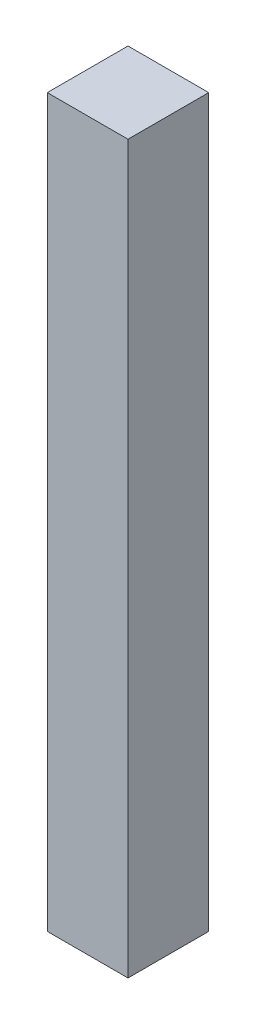
ISO-10303-21;
HEADER;
FILE_DESCRIPTION(('STEP AP214'),'2;1');
FILE_NAME('part.step','',(''),(''),'','','');
FILE_SCHEMA(('AUTOMOTIVE_DESIGN { 1 0 10303 214 1 1 1 1 }'));
ENDSEC;
DATA;
#1=APPLICATION_CONTEXT('core data for automotive mechanical design processes');
#2=APPLICATION_PROTOCOL_DEFINITION('international standard','automotive_design',2000,#1);
#3=PRODUCT_CONTEXT('',#1,'mechanical');
#4=PRODUCT('Part','Part','',(#3));
#5=PRODUCT_RELATED_PRODUCT_CATEGORY('part','',(#4));
#6=PRODUCT_DEFINITION_FORMATION('','',#4);
#7=PRODUCT_DEFINITION_CONTEXT('part definition',#1,'design');
#8=PRODUCT_DEFINITION('design','',#6,#7);
#9=PRODUCT_DEFINITION_SHAPE('','',#8);
#10=(LENGTH_UNIT() NAMED_UNIT(*) SI_UNIT(.MILLI.,.METRE.));
#11=(NAMED_UNIT(*) PLANE_ANGLE_UNIT() SI_UNIT($,.RADIAN.));
#12=(NAMED_UNIT(*) SI_UNIT($,.STERADIAN.) SOLID_ANGLE_UNIT());
#13=UNCERTAINTY_MEASURE_WITH_UNIT(LENGTH_MEASURE(1.E-05),#10,'distance_accuracy_value','');
#14=(GEOMETRIC_REPRESENTATION_CONTEXT(3) GLOBAL_UNCERTAINTY_ASSIGNED_CONTEXT((#13)) GLOBAL_UNIT_ASSIGNED_CONTEXT((#10,
#11,#12)) REPRESENTATION_CONTEXT('',''));
#15=CARTESIAN_POINT('',(0.,0.,0.));
#16=DIRECTION('',(0.,0.,1.));
#17=DIRECTION('',(1.,0.,0.));
#18=AXIS2_PLACEMENT_3D('',#15,#16,#17);
#19=CARTESIAN_POINT('',(50.8,914.4,50.8));
#20=DIRECTION('',(-1.,0.,0.));
#21=DIRECTION('',(0.,0.,1.));
#22=AXIS2_PLACEMENT_3D('',#19,#20,#21);
#23=PLANE('',#22);
#24=DIRECTION('',(0.,0.,-1.));
#25=VECTOR('',#24,1.);
#26=CARTESIAN_POINT('',(50.8,0.,50.8));
#27=LINE('',#26,#25);
#28=CARTESIAN_POINT('',(50.8,0.,50.8));
#29=VERTEX_POINT('',#28);
#30=CARTESIAN_POINT('',(50.8,0.,-50.8));
#31=VERTEX_POINT('',#30);
#32=EDGE_CURVE('E111',#29,#31,#27,.T.);
#33=ORIENTED_EDGE('',*,*,#32,.T.);
#34=DIRECTION('',(0.,-1.,0.));
#35=VECTOR('',#34,1.);
#36=CARTESIAN_POINT('',(50.8,914.4,-50.8));
#37=LINE('',#36,#35);
#38=CARTESIAN_POINT('',(50.8,914.4,-50.8));
#39=VERTEX_POINT('',#38);
#40=EDGE_CURVE('E11',#39,#31,#37,.T.);
#41=ORIENTED_EDGE('',*,*,#40,.F.);
#42=DIRECTION('',(0.,0.,-1.));
#43=VECTOR('',#42,1.);
#44=CARTESIAN_POINT('',(50.8,914.4,50.8));
#45=LINE('',#44,#43);
#46=CARTESIAN_POINT('',(50.8,914.4,50.8));
#47=VERTEX_POINT('',#46);
#48=EDGE_CURVE('E95',#47,#39,#45,.T.);
#49=ORIENTED_EDGE('',*,*,#48,.F.);
#50=DIRECTION('',(0.,-1.,0.));
#51=VECTOR('',#50,1.);
#52=CARTESIAN_POINT('',(50.8,914.4,50.8));
#53=LINE('',#52,#51);
#54=EDGE_CURVE('E107',#47,#29,#53,.T.);
#55=ORIENTED_EDGE('',*,*,#54,.T.);
#56=EDGE_LOOP('',(#33,#41,#49,#55));
#57=FACE_BOUND('',#56,.T.);
#58=ADVANCED_FACE('F43',(#57),#23,.F.);
#59=CARTESIAN_POINT('',(-50.8,914.4,-50.8));
#60=DIRECTION('',(0.,0.,1.));
#61=DIRECTION('',(1.,0.,0.));
#62=AXIS2_PLACEMENT_3D('',#59,#60,#61);
#63=PLANE('',#62);
#64=DIRECTION('',(-1.,0.,0.));
#65=VECTOR('',#64,1.);
#66=CARTESIAN_POINT('',(-50.8,0.,-50.8));
#67=LINE('',#66,#65);
#68=CARTESIAN_POINT('',(-50.8,0.,-50.8));
#69=VERTEX_POINT('',#68);
#70=EDGE_CURVE('E100',#31,#69,#67,.T.);
#71=ORIENTED_EDGE('',*,*,#70,.T.);
#72=DIRECTION('',(0.,-1.,0.));
#73=VECTOR('',#72,1.);
#74=CARTESIAN_POINT('',(-50.8,914.4,-50.8));
#75=LINE('',#74,#73);
#76=CARTESIAN_POINT('',(-50.8,914.4,-50.8));
#77=VERTEX_POINT('',#76);
#78=EDGE_CURVE('E52',#77,#69,#75,.T.);
#79=ORIENTED_EDGE('',*,*,#78,.F.);
#80=DIRECTION('',(-1.,0.,0.));
#81=VECTOR('',#80,1.);
#82=CARTESIAN_POINT('',(-50.8,914.4,-50.8));
#83=LINE('',#82,#81);
#84=EDGE_CURVE('E90',#39,#77,#83,.T.);
#85=ORIENTED_EDGE('',*,*,#84,.F.);
#86=ORIENTED_EDGE('',*,*,#40,.T.);
#87=EDGE_LOOP('',(#71,#79,#85,#86));
#88=FACE_BOUND('',#87,.T.);
#89=ADVANCED_FACE('F99',(#88),#63,.F.);
#90=CARTESIAN_POINT('',(-50.8,914.4,50.8));
#91=DIRECTION('',(1.,0.,0.));
#92=DIRECTION('',(0.,0.,-1.));
#93=AXIS2_PLACEMENT_3D('',#90,#91,#92);
#94=PLANE('',#93);
#95=DIRECTION('',(0.,0.,1.));
#96=VECTOR('',#95,1.);
#97=CARTESIAN_POINT('',(-50.8,0.,50.8));
#98=LINE('',#97,#96);
#99=CARTESIAN_POINT('',(-50.8,0.,50.8));
#100=VERTEX_POINT('',#99);
#101=EDGE_CURVE('E77',#69,#100,#98,.T.);
#102=ORIENTED_EDGE('',*,*,#101,.T.);
#103=DIRECTION('',(0.,-1.,0.));
#104=VECTOR('',#103,1.);
#105=CARTESIAN_POINT('',(-50.8,914.4,50.8));
#106=LINE('',#105,#104);
#107=CARTESIAN_POINT('',(-50.8,914.4,50.8));
#108=VERTEX_POINT('',#107);
#109=EDGE_CURVE('E102',#108,#100,#106,.T.);
#110=ORIENTED_EDGE('',*,*,#109,.F.);
#111=DIRECTION('',(0.,0.,1.));
#112=VECTOR('',#111,1.);
#113=CARTESIAN_POINT('',(-50.8,914.4,50.8));
#114=LINE('',#113,#112);
#115=EDGE_CURVE('E93',#77,#108,#114,.T.);
#116=ORIENTED_EDGE('',*,*,#115,.F.);
#117=ORIENTED_EDGE('',*,*,#78,.T.);
#118=EDGE_LOOP('',(#102,#110,#116,#117));
#119=FACE_BOUND('',#118,.T.);
#120=ADVANCED_FACE('F103',(#119),#94,.F.);
#121=CARTESIAN_POINT('',(-50.8,914.4,50.8));
#122=DIRECTION('',(0.,0.,-1.));
#123=DIRECTION('',(-1.,0.,0.));
#124=AXIS2_PLACEMENT_3D('',#121,#122,#123);
#125=PLANE('',#124);
#126=DIRECTION('',(1.,0.,0.));
#127=VECTOR('',#126,1.);
#128=CARTESIAN_POINT('',(-50.8,0.,50.8));
#129=LINE('',#128,#127);
#130=EDGE_CURVE('E83',#100,#29,#129,.T.);
#131=ORIENTED_EDGE('',*,*,#130,.T.);
#132=ORIENTED_EDGE('',*,*,#54,.F.);
#133=DIRECTION('',(1.,0.,0.));
#134=VECTOR('',#133,1.);
#135=CARTESIAN_POINT('',(-50.8,914.4,50.8));
#136=LINE('',#135,#134);
#137=EDGE_CURVE('E60',#108,#47,#136,.T.);
#138=ORIENTED_EDGE('',*,*,#137,.F.);
#139=ORIENTED_EDGE('',*,*,#109,.T.);
#140=EDGE_LOOP('',(#131,#132,#138,#139));
#141=FACE_BOUND('',#140,.T.);
#142=ADVANCED_FACE('F124',(#141),#125,.F.);
#143=CARTESIAN_POINT('',(0.,914.4,0.));
#144=DIRECTION('',(0.,-1.,0.));
#145=DIRECTION('',(0.,0.,-1.));
#146=AXIS2_PLACEMENT_3D('',#143,#144,#145);
#147=PLANE('',#146);
#148=ORIENTED_EDGE('',*,*,#48,.T.);
#149=ORIENTED_EDGE('',*,*,#84,.T.);
#150=ORIENTED_EDGE('',*,*,#115,.T.);
#151=ORIENTED_EDGE('',*,*,#137,.T.);
#152=EDGE_LOOP('',(#148,#149,#150,#151));
#153=FACE_BOUND('',#152,.T.);
#154=ADVANCED_FACE('F91',(#153),#147,.F.);
#155=CARTESIAN_POINT('',(0.,0.,0.));
#156=DIRECTION('',(0.,-1.,0.));
#157=DIRECTION('',(0.,0.,-1.));
#158=AXIS2_PLACEMENT_3D('',#155,#156,#157);
#159=PLANE('',#158);
#160=ORIENTED_EDGE('',*,*,#32,.F.);
#161=ORIENTED_EDGE('',*,*,#130,.F.);
#162=ORIENTED_EDGE('',*,*,#101,.F.);
#163=ORIENTED_EDGE('',*,*,#70,.F.);
#164=EDGE_LOOP('',(#160,#161,#162,#163));
#165=FACE_BOUND('',#164,.T.);
#166=ADVANCED_FACE('F127',(#165),#159,.T.);
#167=CLOSED_SHELL('',(#58,#89,#120,#142,#154,#166));
#168=MANIFOLD_SOLID_BREP('B2',#167);
#169=ADVANCED_BREP_SHAPE_REPRESENTATION('',(#18,#168),#14);
#170=SHAPE_DEFINITION_REPRESENTATION(#9,#169);
ENDSEC;
END-ISO-10303-21;
